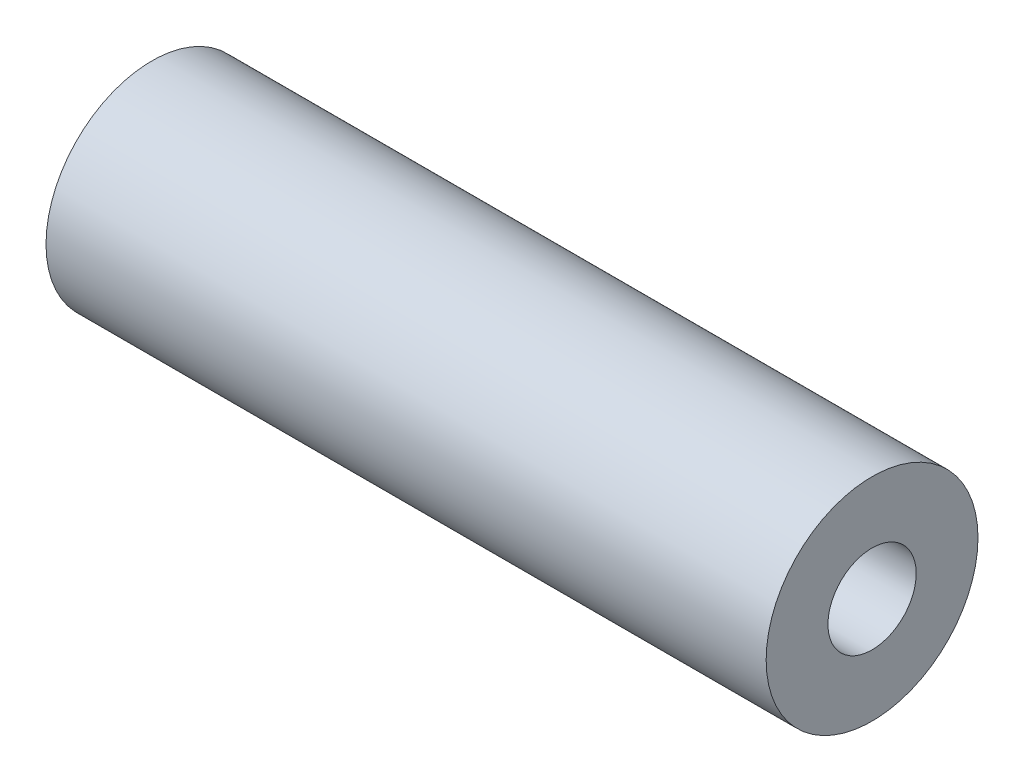
ISO-10303-21;
HEADER;
FILE_DESCRIPTION(('STEP AP214'),'2;1');
FILE_NAME('part.step','',(''),(''),'','','');
FILE_SCHEMA(('AUTOMOTIVE_DESIGN { 1 0 10303 214 1 1 1 1 }'));
ENDSEC;
DATA;
#1=APPLICATION_CONTEXT('core data for automotive mechanical design processes');
#2=APPLICATION_PROTOCOL_DEFINITION('international standard','automotive_design',2000,#1);
#3=PRODUCT_CONTEXT('',#1,'mechanical');
#4=PRODUCT('Part','Part','',(#3));
#5=PRODUCT_RELATED_PRODUCT_CATEGORY('part','',(#4));
#6=PRODUCT_DEFINITION_FORMATION('','',#4);
#7=PRODUCT_DEFINITION_CONTEXT('part definition',#1,'design');
#8=PRODUCT_DEFINITION('design','',#6,#7);
#9=PRODUCT_DEFINITION_SHAPE('','',#8);
#10=(LENGTH_UNIT() NAMED_UNIT(*) SI_UNIT(.MILLI.,.METRE.));
#11=(NAMED_UNIT(*) PLANE_ANGLE_UNIT() SI_UNIT($,.RADIAN.));
#12=(NAMED_UNIT(*) SI_UNIT($,.STERADIAN.) SOLID_ANGLE_UNIT());
#13=UNCERTAINTY_MEASURE_WITH_UNIT(LENGTH_MEASURE(1.E-05),#10,'distance_accuracy_value','');
#14=(GEOMETRIC_REPRESENTATION_CONTEXT(3) GLOBAL_UNCERTAINTY_ASSIGNED_CONTEXT((#13)) GLOBAL_UNIT_ASSIGNED_CONTEXT((#10,
#11,#12)) REPRESENTATION_CONTEXT('',''));
#15=CARTESIAN_POINT('',(0.,0.,0.));
#16=DIRECTION('',(0.,0.,1.));
#17=DIRECTION('',(1.,0.,0.));
#18=AXIS2_PLACEMENT_3D('',#15,#16,#17);
#19=CARTESIAN_POINT('',(9.549694E-12,927.139634050978,-362.357302301474));
#20=DIRECTION('',(1.,0.,0.));
#21=DIRECTION('',(0.,0.,-1.));
#22=AXIS2_PLACEMENT_3D('',#19,#20,#21);
#23=CYLINDRICAL_SURFACE('',#22,1.25);
#24=CARTESIAN_POINT('',(10.1983609207177,927.139634050978,-362.357302301474));
#25=DIRECTION('',(1.,0.,0.));
#26=DIRECTION('',(0.,0.,-1.));
#27=AXIS2_PLACEMENT_3D('',#24,#25,#26);
#28=CIRCLE('',#27,1.25);
#29=CARTESIAN_POINT('',(10.1983609207177,927.139634050978,-363.607302301474));
#30=VERTEX_POINT('',#29);
#31=EDGE_CURVE('E27',#30,#30,#28,.F.);
#32=ORIENTED_EDGE('',*,*,#31,.F.);
#33=EDGE_LOOP('',(#32));
#34=FACE_BOUND('',#33,.T.);
#35=CARTESIAN_POINT('',(-10.1983609206986,927.139634050978,-362.357302301474));
#36=DIRECTION('',(1.,0.,0.));
#37=DIRECTION('',(0.,0.,-1.));
#38=AXIS2_PLACEMENT_3D('',#35,#36,#37);
#39=CIRCLE('',#38,1.25);
#40=CARTESIAN_POINT('',(-10.1983609206986,927.139634050978,-363.607302301474));
#41=VERTEX_POINT('',#40);
#42=EDGE_CURVE('E18',#41,#41,#39,.T.);
#43=ORIENTED_EDGE('',*,*,#42,.F.);
#44=EDGE_LOOP('',(#43));
#45=FACE_BOUND('',#44,.T.);
#46=ADVANCED_FACE('F15',(#34,#45),#23,.F.);
#47=CARTESIAN_POINT('',(-10.1983609206986,927.139634050978,-362.357302301473));
#48=DIRECTION('',(-1.,0.,0.));
#49=DIRECTION('',(0.,0.,1.));
#50=AXIS2_PLACEMENT_3D('',#47,#48,#49);
#51=PLANE('',#50);
#52=ORIENTED_EDGE('',*,*,#42,.T.);
#53=EDGE_LOOP('',(#52));
#54=FACE_BOUND('',#53,.T.);
#55=CARTESIAN_POINT('',(-10.1983609206986,927.139634050978,-362.357302301474));
#56=DIRECTION('',(1.,0.,0.));
#57=DIRECTION('',(0.,0.,-1.));
#58=AXIS2_PLACEMENT_3D('',#55,#56,#57);
#59=CIRCLE('',#58,3.);
#60=CARTESIAN_POINT('',(-10.1983609206986,927.139634050978,-365.357302301474));
#61=VERTEX_POINT('',#60);
#62=EDGE_CURVE('E22',#61,#61,#59,.T.);
#63=ORIENTED_EDGE('',*,*,#62,.F.);
#64=EDGE_LOOP('',(#63));
#65=FACE_BOUND('',#64,.T.);
#66=ADVANCED_FACE('F35',(#54,#65),#51,.T.);
#67=CARTESIAN_POINT('',(10.1983609207177,927.139634050978,-362.357302301474));
#68=DIRECTION('',(1.,0.,0.));
#69=DIRECTION('',(0.,0.,-1.));
#70=AXIS2_PLACEMENT_3D('',#67,#68,#69);
#71=PLANE('',#70);
#72=ORIENTED_EDGE('',*,*,#31,.T.);
#73=EDGE_LOOP('',(#72));
#74=FACE_BOUND('',#73,.T.);
#75=CARTESIAN_POINT('',(10.1983609207177,927.139634050978,-362.357302301474));
#76=DIRECTION('',(1.,0.,0.));
#77=DIRECTION('',(0.,0.,-1.));
#78=AXIS2_PLACEMENT_3D('',#75,#76,#77);
#79=CIRCLE('',#78,3.);
#80=CARTESIAN_POINT('',(10.1983609207177,927.139634050978,-365.357302301474));
#81=VERTEX_POINT('',#80);
#82=EDGE_CURVE('E10',#81,#81,#79,.F.);
#83=ORIENTED_EDGE('',*,*,#82,.F.);
#84=EDGE_LOOP('',(#83));
#85=FACE_BOUND('',#84,.T.);
#86=ADVANCED_FACE('F44',(#74,#85),#71,.T.);
#87=CARTESIAN_POINT('',(9.549694E-12,927.139634050978,-362.357302301474));
#88=DIRECTION('',(1.,0.,0.));
#89=DIRECTION('',(0.,0.,-1.));
#90=AXIS2_PLACEMENT_3D('',#87,#88,#89);
#91=CYLINDRICAL_SURFACE('',#90,3.);
#92=ORIENTED_EDGE('',*,*,#62,.T.);
#93=EDGE_LOOP('',(#92));
#94=FACE_BOUND('',#93,.T.);
#95=ORIENTED_EDGE('',*,*,#82,.T.);
#96=EDGE_LOOP('',(#95));
#97=FACE_BOUND('',#96,.T.);
#98=ADVANCED_FACE('F45',(#94,#97),#91,.T.);
#99=CLOSED_SHELL('',(#46,#66,#86,#98));
#100=MANIFOLD_SOLID_BREP('B1',#99);
#101=ADVANCED_BREP_SHAPE_REPRESENTATION('',(#18,#100),#14);
#102=SHAPE_DEFINITION_REPRESENTATION(#9,#101);
ENDSEC;
END-ISO-10303-21;
